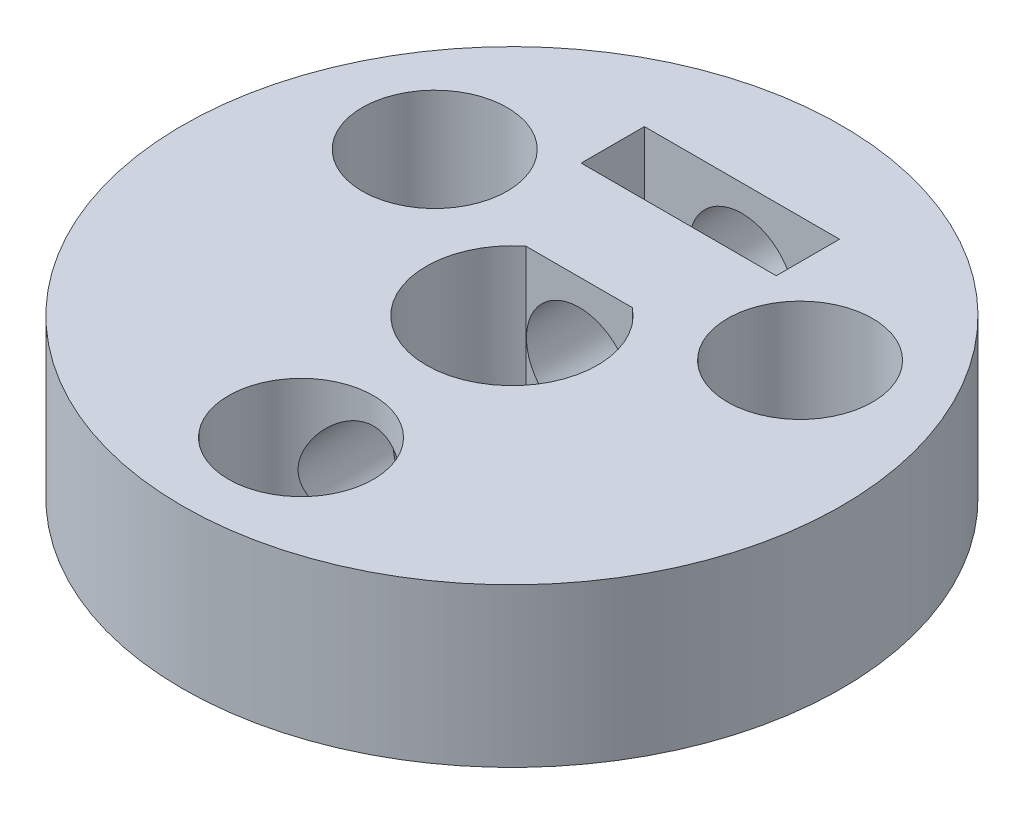
ISO-10303-21;
HEADER;
FILE_DESCRIPTION(('STEP AP214'),'2;1');
FILE_NAME('part.step','',(''),(''),'','','');
FILE_SCHEMA(('AUTOMOTIVE_DESIGN { 1 0 10303 214 1 1 1 1 }'));
ENDSEC;
DATA;
#1=APPLICATION_CONTEXT('core data for automotive mechanical design processes');
#2=APPLICATION_PROTOCOL_DEFINITION('international standard','automotive_design',2000,#1);
#3=PRODUCT_CONTEXT('',#1,'mechanical');
#4=PRODUCT('Part','Part','',(#3));
#5=PRODUCT_RELATED_PRODUCT_CATEGORY('part','',(#4));
#6=PRODUCT_DEFINITION_FORMATION('','',#4);
#7=PRODUCT_DEFINITION_CONTEXT('part definition',#1,'design');
#8=PRODUCT_DEFINITION('design','',#6,#7);
#9=PRODUCT_DEFINITION_SHAPE('','',#8);
#10=(LENGTH_UNIT() NAMED_UNIT(*) SI_UNIT(.MILLI.,.METRE.));
#11=(NAMED_UNIT(*) PLANE_ANGLE_UNIT() SI_UNIT($,.RADIAN.));
#12=(NAMED_UNIT(*) SI_UNIT($,.STERADIAN.) SOLID_ANGLE_UNIT());
#13=UNCERTAINTY_MEASURE_WITH_UNIT(LENGTH_MEASURE(1.E-05),#10,'distance_accuracy_value','');
#14=(GEOMETRIC_REPRESENTATION_CONTEXT(3) GLOBAL_UNCERTAINTY_ASSIGNED_CONTEXT((#13)) GLOBAL_UNIT_ASSIGNED_CONTEXT((#10,
#11,#12)) REPRESENTATION_CONTEXT('',''));
#15=CARTESIAN_POINT('',(0.,0.,0.));
#16=DIRECTION('',(0.,0.,1.));
#17=DIRECTION('',(1.,0.,0.));
#18=AXIS2_PLACEMENT_3D('',#15,#16,#17);
#19=CARTESIAN_POINT('',(0.,3.,-12.501));
#20=DIRECTION('',(0.,0.,1.));
#21=DIRECTION('',(1.,0.,0.));
#22=AXIS2_PLACEMENT_3D('',#19,#20,#21);
#23=CYLINDRICAL_SURFACE('',#22,2.);
#24=CARTESIAN_POINT('',(0.,3.,-6.325));
#25=DIRECTION('',(0.,0.,1.));
#26=DIRECTION('',(1.,0.,0.));
#27=AXIS2_PLACEMENT_3D('',#24,#25,#26);
#28=CIRCLE('',#27,2.);
#29=CARTESIAN_POINT('',(2.,3.,-6.325));
#30=VERTEX_POINT('',#29);
#31=EDGE_CURVE('E101',#30,#30,#28,.T.);
#32=ORIENTED_EDGE('',*,*,#31,.F.);
#33=EDGE_LOOP('',(#32));
#34=FACE_BOUND('',#33,.T.);
#35=CARTESIAN_POINT('',(0.,3.,-2.55));
#36=DIRECTION('',(0.,0.,1.));
#37=DIRECTION('',(1.,0.,0.));
#38=AXIS2_PLACEMENT_3D('',#35,#36,#37);
#39=CIRCLE('',#38,2.);
#40=CARTESIAN_POINT('',(2.,3.,-2.55));
#41=VERTEX_POINT('',#40);
#42=EDGE_CURVE('E188',#41,#41,#39,.T.);
#43=ORIENTED_EDGE('',*,*,#42,.T.);
#44=EDGE_LOOP('',(#43));
#45=FACE_BOUND('',#44,.T.);
#46=ADVANCED_FACE('F33',(#34,#45),#23,.F.);
#47=CARTESIAN_POINT('',(0.,-0.00100000000000013,0.));
#48=DIRECTION('',(0.,1.,0.));
#49=DIRECTION('',(0.,0.,1.));
#50=AXIS2_PLACEMENT_3D('',#47,#48,#49);
#51=CYLINDRICAL_SURFACE('',#50,3.25);
#52=CARTESIAN_POINT('',(0.,0.,0.));
#53=DIRECTION('',(0.,1.,0.));
#54=DIRECTION('',(0.,0.,1.));
#55=AXIS2_PLACEMENT_3D('',#52,#53,#54);
#56=CIRCLE('',#55,3.25);
#57=CARTESIAN_POINT('',(2.01494416796099,0.,-2.55));
#58=VERTEX_POINT('',#57);
#59=CARTESIAN_POINT('',(-2.01494416796099,0.,-2.55));
#60=VERTEX_POINT('',#59);
#61=EDGE_CURVE('E226',#58,#60,#56,.F.);
#62=ORIENTED_EDGE('',*,*,#61,.T.);
#63=DIRECTION('',(0.,1.,0.));
#64=VECTOR('',#63,1.);
#65=CARTESIAN_POINT('',(-2.01494416796099,-0.00100000000000013,-2.55));
#66=LINE('',#65,#64);
#67=CARTESIAN_POINT('',(-2.01494416796099,6.,-2.55));
#68=VERTEX_POINT('',#67);
#69=EDGE_CURVE('E223',#60,#68,#66,.T.);
#70=ORIENTED_EDGE('',*,*,#69,.T.);
#71=CARTESIAN_POINT('',(0.,6.,0.));
#72=DIRECTION('',(0.,1.,0.));
#73=DIRECTION('',(0.,0.,1.));
#74=AXIS2_PLACEMENT_3D('',#71,#72,#73);
#75=CIRCLE('',#74,3.25);
#76=CARTESIAN_POINT('',(2.01494416796099,6.,-2.55));
#77=VERTEX_POINT('',#76);
#78=EDGE_CURVE('E220',#68,#77,#75,.T.);
#79=ORIENTED_EDGE('',*,*,#78,.T.);
#80=DIRECTION('',(0.,1.,0.));
#81=VECTOR('',#80,1.);
#82=CARTESIAN_POINT('',(2.01494416796099,-0.00100000000000013,-2.55));
#83=LINE('',#82,#81);
#84=EDGE_CURVE('E224',#58,#77,#83,.T.);
#85=ORIENTED_EDGE('',*,*,#84,.F.);
#86=EDGE_LOOP('',(#62,#70,#79,#85));
#87=FACE_BOUND('',#86,.T.);
#88=CARTESIAN_POINT('',(-2.,3.,2.5617376914899));
#89=CARTESIAN_POINT('',(-1.99999257295541,2.90021367587737,2.56174918525118));
#90=CARTESIAN_POINT('',(-1.99246417037299,2.80025503727231,2.56767601362471));
#91=CARTESIAN_POINT('',(-1.96287192481038,2.60366049217224,2.59035812934363));
#92=CARTESIAN_POINT('',(-1.94076594329612,2.50703507546794,2.60714480592539));
#93=CARTESIAN_POINT('',(-1.8835566044913,2.32054962789503,2.64876209810368));
#94=CARTESIAN_POINT('',(-1.84856291696548,2.23063999713114,2.6735246252609));
#95=CARTESIAN_POINT('',(-1.76689292791349,2.05808006288375,2.72818612541692));
#96=CARTESIAN_POINT('',(-1.7202169785151,1.97542954069696,2.75808494358867));
#97=CARTESIAN_POINT('',(-1.60945707421707,1.80794695547524,2.82432768187998));
#98=CARTESIAN_POINT('',(-1.54390122328284,1.72421963446998,2.86100475213121));
#99=CARTESIAN_POINT('',(-1.40024942951129,1.56801801513385,2.9339911029288));
#100=CARTESIAN_POINT('',(-1.32214288380353,1.495553334257,2.97030004466079));
#101=CARTESIAN_POINT('',(-1.14466828928344,1.35563852541508,3.04343006835412));
#102=CARTESIAN_POINT('',(-1.04388608423797,1.28973707955523,3.07982491679294));
#103=CARTESIAN_POINT('',(-0.829998273407998,1.17634760006513,3.14420573001945));
#104=CARTESIAN_POINT('',(-0.716904685671716,1.12884181194795,3.17219979688077));
#105=CARTESIAN_POINT('',(-0.493455020388312,1.05865516596643,3.2141269852472));
#106=CARTESIAN_POINT('',(-0.383941651247491,1.03397810292726,3.22918005823652));
#107=CARTESIAN_POINT('',(-0.161406875995682,1.00337189349303,3.24790223797376));
#108=CARTESIAN_POINT('',(-0.0483891205314176,0.997423857860114,3.25158281442983));
#109=CARTESIAN_POINT('',(0.162049292467179,1.00416529414437,3.24743910919448));
#110=CARTESIAN_POINT('',(0.259584307293745,1.01452837228564,3.24105075040065));
#111=CARTESIAN_POINT('',(0.451217466602257,1.04913312115325,3.21996781004166));
#112=CARTESIAN_POINT('',(0.545315350784595,1.07337584069925,3.20527260076766));
#113=CARTESIAN_POINT('',(0.728114732784443,1.13474124467069,3.16876662463579));
#114=CARTESIAN_POINT('',(0.816793912888962,1.17191346204701,3.14692851276278));
#115=CARTESIAN_POINT('',(0.986741059586425,1.25775579590704,3.09785023504571));
#116=CARTESIAN_POINT('',(1.06800724282553,1.30642866905955,3.07060877428869));
#117=CARTESIAN_POINT('',(1.23150771270854,1.42059647790192,3.00905667295497));
#118=CARTESIAN_POINT('',(1.31263932628135,1.48742217468013,2.9742888134627));
#119=CARTESIAN_POINT('',(1.46324196898191,1.63256340191605,2.90316668162461));
#120=CARTESIAN_POINT('',(1.53269615484224,1.71089522877357,2.86681021146441));
#121=CARTESIAN_POINT('',(1.66677126601713,1.88835883785493,2.79123600965826));
#122=CARTESIAN_POINT('',(1.72970500538748,1.98886655865017,2.75222807495995));
#123=CARTESIAN_POINT('',(1.83750522715276,2.20143419355725,2.68146414101565));
#124=CARTESIAN_POINT('',(1.88240513318502,2.31347224861993,2.64969477366942));
#125=CARTESIAN_POINT('',(1.94277592323182,2.51649945346157,2.6055984782368));
#126=CARTESIAN_POINT('',(1.96284611176855,2.60548871095613,2.59037237505277));
#127=CARTESIAN_POINT('',(1.9906591395378,2.78640251047185,2.56906520998618));
#128=CARTESIAN_POINT('',(1.9984178271369,2.87832312317789,2.56297239155587));
#129=CARTESIAN_POINT('',(2.00114663030702,3.06264989769542,2.56084299907488));
#130=CARTESIAN_POINT('',(1.99609222808287,3.15505665223182,2.56482570446798));
#131=CARTESIAN_POINT('',(1.97347366976127,3.33743355474596,2.58226537344572));
#132=CARTESIAN_POINT('',(1.95589930103145,3.42740165125937,2.59573007146108));
#133=CARTESIAN_POINT('',(1.909432939958,3.6017763216543,2.63009111034933));
#134=CARTESIAN_POINT('',(1.88065890022416,3.6862304808719,2.65090979587571));
#135=CARTESIAN_POINT('',(1.8128508130306,3.84934302948884,2.69773358443967));
#136=CARTESIAN_POINT('',(1.77381304826382,3.92799930577396,2.72374056574483));
#137=CARTESIAN_POINT('',(1.67819135872918,4.09287452945857,2.78386834620982));
#138=CARTESIAN_POINT('',(1.61969199947816,4.17776149652796,2.81859731003127));
#139=CARTESIAN_POINT('',(1.49058246781728,4.33743089406434,2.88895845167456));
#140=CARTESIAN_POINT('',(1.41996004836075,4.41220296825735,2.92459151151031));
#141=CARTESIAN_POINT('',(1.25617389414914,4.56076481480659,2.99895961912961));
#142=CARTESIAN_POINT('',(1.16122058586532,4.63276608513036,3.03737154236198));
#143=CARTESIAN_POINT('',(0.958183477689743,4.75959687386271,3.10739260661167));
#144=CARTESIAN_POINT('',(0.850106993802706,4.81443589955526,3.13900551100107));
#145=CARTESIAN_POINT('',(0.630936382808474,4.9012841238324,3.19002043080146));
#146=CARTESIAN_POINT('',(0.520501564418012,4.93455155887919,3.21008568101958));
#147=CARTESIAN_POINT('',(0.294156632496273,4.98161137604269,3.23866087689774));
#148=CARTESIAN_POINT('',(0.178253743828156,4.99542875141624,3.24718565148693));
#149=CARTESIAN_POINT('',(-0.0378027268410501,5.00213793056566,3.25131690471873));
#150=CARTESIAN_POINT('',(-0.137851985970449,4.99772616939037,3.24858812135995));
#151=CARTESIAN_POINT('',(-0.335525204569388,4.97416431700683,3.23415158005857));
#152=CARTESIAN_POINT('',(-0.433149214177646,4.95501453074929,3.22244400789989));
#153=CARTESIAN_POINT('',(-0.620682858784026,4.90366975378791,3.19155972324271));
#154=CARTESIAN_POINT('',(-0.710729957034344,4.87184293264837,3.17259435676908));
#155=CARTESIAN_POINT('',(-0.884164568134433,4.79644160602501,3.12870007035302));
#156=CARTESIAN_POINT('',(-0.967550840855142,4.75286491949961,3.10377004333118));
#157=CARTESIAN_POINT('',(-1.13486211630832,4.6500688570234,3.04683470210327));
#158=CARTESIAN_POINT('',(-1.21790677280195,4.58968078811046,3.01435946659724));
#159=CARTESIAN_POINT('',(-1.37330684343255,4.45754943416423,2.94681592323596));
#160=CARTESIAN_POINT('',(-1.44564976868544,4.38579308140633,2.91174465629415));
#161=CARTESIAN_POINT('',(-1.58788935091968,4.22147353838125,2.83697215514017));
#162=CARTESIAN_POINT('',(-1.65607257145252,4.12740561561978,2.79729946659041));
#163=CARTESIAN_POINT('',(-1.77580045841955,3.9274052149667,2.72286787631167));
#164=CARTESIAN_POINT('',(-1.82735638010146,3.82148082858051,2.68810565961235));
#165=CARTESIAN_POINT('',(-1.90228203697712,3.62437146406799,2.63541980815058));
#166=CARTESIAN_POINT('',(-1.92936930042345,3.53514129911901,2.61547094460358));
#167=CARTESIAN_POINT('',(-1.97090926851511,3.3524551354933,2.58432010382459));
#168=CARTESIAN_POINT('',(-1.98540313448477,3.25901396192308,2.57308964354727));
#169=CARTESIAN_POINT('',(-1.99546246145931,3.13744075169137,2.56527433546932));
#170=CARTESIAN_POINT('',(-1.9971617074068,3.11000299374909,2.56395160976314));
#171=CARTESIAN_POINT('',(-1.99943161838139,3.05504787282921,2.56218161135533));
#172=CARTESIAN_POINT('',(-2.00000204908049,3.02753049451045,2.56173452042478));
#173=CARTESIAN_POINT('',(-2.,3.,2.5617376914899));
#174=B_SPLINE_CURVE_WITH_KNOTS('',3,(#88,#89,#90,#91,#92,#93,#94,#95,#96,#97,#98,#99,#100,#101,
#102,#103,#104,#105,#106,#107,#108,#109,#110,#111,#112,#113,#114,#115,#116,#117,#118,#119,#120,
#121,#122,#123,#124,#125,#126,#127,#128,#129,#130,#131,#132,#133,#134,#135,#136,#137,#138,#139,
#140,#141,#142,#143,#144,#145,#146,#147,#148,#149,#150,#151,#152,#153,#154,#155,#156,#157,#158,
#159,#160,#161,#162,#163,#164,#165,#166,#167,#168,#169,#170,#171,#172,#173),.UNSPECIFIED.,.T.,
.F.,(4,2,2,2,2,2,2,2,2,2,2,2,2,2,2,2,2,2,2,2,2,2,2,2,2,2,2,2,2,2,2,2,2,2,2,2,2,2,2,2,2,2,4),(0.,
0.299232393910509,0.599333574999374,0.896937883517602,1.19453322269994,1.53068544499641,
1.86712315749446,2.24246277721421,2.61743923126028,2.95519221848558,3.29260445425413,
3.58607334277618,3.87956441029894,4.17419245756178,4.46889119795355,4.79971798388065,
5.13101792793272,5.50369761894355,5.87568336785438,6.15197255272927,6.42790578629545,
6.70436741536107,6.98105481488619,7.25490378598819,7.52885207642913,7.85397436334755,
8.1794270516913,8.55312150036134,8.92660856741893,9.27567623393334,9.62429493900469,
9.9233355986358,10.2223700708567,10.5132883786366,10.8042607246735,11.1260850248725,
11.4482819793199,11.8149155513861,12.1813004206788,12.4662731905945,12.7503109893249,
12.8328504181994,12.915406979435),.UNSPECIFIED.);
#175=CARTESIAN_POINT('',(-2.,3.,2.5617376914899));
#176=VERTEX_POINT('',#175);
#177=EDGE_CURVE('E135',#176,#176,#174,.T.);
#178=ORIENTED_EDGE('',*,*,#177,.T.);
#179=EDGE_LOOP('',(#178));
#180=FACE_BOUND('',#179,.T.);
#181=ADVANCED_FACE('F163',(#87,#180),#51,.F.);
#182=CARTESIAN_POINT('',(0.,-0.00100000000000013,8.));
#183=DIRECTION('',(0.,1.,0.));
#184=DIRECTION('',(0.,0.,1.));
#185=AXIS2_PLACEMENT_3D('',#182,#183,#184);
#186=CYLINDRICAL_SURFACE('',#185,2.75);
#187=CARTESIAN_POINT('',(0.,6.,8.));
#188=DIRECTION('',(0.,1.,0.));
#189=DIRECTION('',(0.,0.,1.));
#190=AXIS2_PLACEMENT_3D('',#187,#188,#189);
#191=CIRCLE('',#190,2.75);
#192=CARTESIAN_POINT('',(0.,6.,10.75));
#193=VERTEX_POINT('',#192);
#194=EDGE_CURVE('E195',#193,#193,#191,.T.);
#195=ORIENTED_EDGE('',*,*,#194,.T.);
#196=EDGE_LOOP('',(#195));
#197=FACE_BOUND('',#196,.T.);
#198=CARTESIAN_POINT('',(0.,0.,8.));
#199=DIRECTION('',(0.,1.,0.));
#200=DIRECTION('',(0.,0.,1.));
#201=AXIS2_PLACEMENT_3D('',#198,#199,#200);
#202=CIRCLE('',#201,2.75);
#203=CARTESIAN_POINT('',(0.,0.,10.75));
#204=VERTEX_POINT('',#203);
#205=EDGE_CURVE('E199',#204,#204,#202,.F.);
#206=ORIENTED_EDGE('',*,*,#205,.T.);
#207=EDGE_LOOP('',(#206));
#208=FACE_BOUND('',#207,.T.);
#209=CARTESIAN_POINT('',(-2.,3.,6.11254139118231));
#210=CARTESIAN_POINT('',(-1.99999984155439,3.04728125371528,6.11254108272452));
#211=CARTESIAN_POINT('',(-1.99831819251388,3.09456415963721,6.1107539315617));
#212=CARTESIAN_POINT('',(-1.99164320772081,3.18864606377105,6.10371994513093));
#213=CARTESIAN_POINT('',(-1.98664804287353,3.23544478020654,6.0984711990363));
#214=CARTESIAN_POINT('',(-1.96682839563104,3.37464047942902,6.07790072868115));
#215=CARTESIAN_POINT('',(-1.94717030742436,3.46568782837265,6.05775613818325));
#216=CARTESIAN_POINT('',(-1.89681520265042,3.64055606468464,6.00857174396726));
#217=CARTESIAN_POINT('',(-1.86626096962394,3.72445379518771,5.97964768450189));
#218=CARTESIAN_POINT('',(-1.79534831067652,3.8857069046237,5.91637650200721));
#219=CARTESIAN_POINT('',(-1.75499063610095,3.96306278431826,5.88202979464552));
#220=CARTESIAN_POINT('',(-1.65658671757259,4.12533890890335,5.80389329766668));
#221=CARTESIAN_POINT('',(-1.59662989854071,4.20883802505276,5.75956030901626));
#222=CARTESIAN_POINT('',(-1.46455313632915,4.36587718923576,5.67106790980191));
#223=CARTESIAN_POINT('',(-1.39241669401629,4.43940348061769,5.62690881897529));
#224=CARTESIAN_POINT('',(-1.22191593323149,4.58807671033047,5.5341308332997));
#225=CARTESIAN_POINT('',(-1.12116905018419,4.66097366825202,5.4862137273213));
#226=CARTESIAN_POINT('',(-0.904709730836273,4.78805743517574,5.40048836395184));
#227=CARTESIAN_POINT('',(-0.789030682902019,4.84228502567908,5.36265811408635));
#228=CARTESIAN_POINT('',(-0.580898486641062,4.91599184875347,5.31056425163251));
#229=CARTESIAN_POINT('',(-0.491291877256693,4.94097583705473,5.29265374605196));
#230=CARTESIAN_POINT('',(-0.308196816428559,4.97831209133791,5.2657639589227));
#231=CARTESIAN_POINT('',(-0.214711693803512,4.99067496546422,5.25677717708891));
#232=CARTESIAN_POINT('',(-0.0262808864996537,5.00205876292217,5.24850512077219));
#233=CARTESIAN_POINT('',(0.0686676476823136,5.00104913242008,5.24924206328378));
#234=CARTESIAN_POINT('',(0.25690411803724,4.98567922896213,5.26040248118521));
#235=CARTESIAN_POINT('',(0.350191620696873,4.9713155212999,5.27082844861934));
#236=CARTESIAN_POINT('',(0.529811030388283,4.93068422906926,5.3000278103106));
#237=CARTESIAN_POINT('',(0.616266091321901,4.90477308633253,5.31855095870417));
#238=CARTESIAN_POINT('',(0.783356660834583,4.84236664354322,5.36251529894373));
#239=CARTESIAN_POINT('',(0.863990979736847,4.80586918740512,5.38795789998984));
#240=CARTESIAN_POINT('',(1.02685156913081,4.71901503938701,5.44727715956325));
#241=CARTESIAN_POINT('',(1.10826822517769,4.66757220257491,5.48177528707053));
#242=CARTESIAN_POINT('',(1.26174159175043,4.55470238132046,5.55505501065001));
#243=CARTESIAN_POINT('',(1.33378912710009,4.49326574048607,5.59384073783225));
#244=CARTESIAN_POINT('',(1.48075296770533,4.34903503832561,5.68084794868906));
#245=CARTESIAN_POINT('',(1.55363052271214,4.26439956968405,5.72946574964715));
#246=CARTESIAN_POINT('',(1.68476999709799,4.08352761704406,5.82500142856327));
#247=CARTESIAN_POINT('',(1.74302982684384,3.98728947732842,5.87191906265979));
#248=CARTESIAN_POINT('',(1.83263084837037,3.80582562868107,5.94898385897202));
#249=CARTESIAN_POINT('',(1.86707016477259,3.72274533167856,5.98056051726082));
#250=CARTESIAN_POINT('',(1.92492794619532,3.55034165900098,6.03562845535775));
#251=CARTESIAN_POINT('',(1.94837113565918,3.4610328128955,6.05913784188509));
#252=CARTESIAN_POINT('',(1.97999685641612,3.29273070436806,6.09145469921778));
#253=CARTESIAN_POINT('',(1.99004865362631,3.21444035512654,6.10203824792857));
#254=CARTESIAN_POINT('',(2.00076253499095,3.0565321144089,6.11333151346848));
#255=CARTESIAN_POINT('',(2.00143259480512,2.97691540816812,6.11404961716003));
#256=CARTESIAN_POINT('',(1.99334933188403,2.81883632979744,6.10551160206503));
#257=CARTESIAN_POINT('',(1.98460796100032,2.74037262156915,6.09626813375628));
#258=CARTESIAN_POINT('',(1.9583326610144,2.58641172995985,6.0692541673511));
#259=CARTESIAN_POINT('',(1.94078511877718,2.51091933527805,6.05147046906782));
#260=CARTESIAN_POINT('',(1.88906507232879,2.33443475357644,6.00107653637737));
#261=CARTESIAN_POINT('',(1.85103979225192,2.23546702410755,5.96537890389258));
#262=CARTESIAN_POINT('',(1.76135257634627,2.0467956452537,5.88725791180085));
#263=CARTESIAN_POINT('',(1.70966337626722,1.95711102238374,5.8448211737024));
#264=CARTESIAN_POINT('',(1.59206043862426,1.78487465727457,5.75647163938782));
#265=CARTESIAN_POINT('',(1.52576759508555,1.70261637044464,5.71049284765223));
#266=CARTESIAN_POINT('',(1.38062092197828,1.54912858237901,5.62014897517391));
#267=CARTESIAN_POINT('',(1.30177760385993,1.47788994939587,5.57578258185342));
#268=CARTESIAN_POINT('',(1.13578712781601,1.35062757010063,5.49387305891844));
#269=CARTESIAN_POINT('',(1.04915614905013,1.29407336279905,5.45611595044951));
#270=CARTESIAN_POINT('',(0.865858942533445,1.19412977402688,5.38804103320956));
#271=CARTESIAN_POINT('',(0.769195528442628,1.15073671474821,5.35772114660292));
#272=CARTESIAN_POINT('',(0.566909814049588,1.07900824809115,5.30703537478398));
#273=CARTESIAN_POINT('',(0.461219613556808,1.05080123908047,5.28675448185376));
#274=CARTESIAN_POINT('',(0.245057376585389,1.0120458685135,5.25878194086196));
#275=CARTESIAN_POINT('',(0.134590786945295,1.00147790981747,5.25107632177293));
#276=CARTESIAN_POINT('',(-0.0707535425724048,0.99900112384757,5.24927227483213));
#277=CARTESIAN_POINT('',(-0.165597341304916,1.00463603468782,5.25338259333128));
#278=CARTESIAN_POINT('',(-0.352650739038191,1.02907868469812,5.27108830644071));
#279=CARTESIAN_POINT('',(-0.444860224453036,1.04788699098708,5.28468410940405));
#280=CARTESIAN_POINT('',(-0.622285231512081,1.09708979758927,5.31983595508423));
#281=CARTESIAN_POINT('',(-0.707607862604178,1.12722908974504,5.34121635287552));
#282=CARTESIAN_POINT('',(-0.871833031446705,1.1978060852343,5.39044743299996));
#283=CARTESIAN_POINT('',(-0.950734528941587,1.23824545286612,5.41829916091436));
#284=CARTESIAN_POINT('',(-1.11114763837623,1.33410552876013,5.48280323020027));
#285=CARTESIAN_POINT('',(-1.19162125544056,1.39080097918136,5.52013257372991));
#286=CARTESIAN_POINT('',(-1.34248104361179,1.51431201512418,5.59844083392049));
#287=CARTESIAN_POINT('',(-1.4128533683846,1.58114123843664,5.63942463757659));
#288=CARTESIAN_POINT('',(-1.55536987895687,1.73744257655355,5.73025573861683));
#289=CARTESIAN_POINT('',(-1.6253167412596,1.82880501427508,5.78030932011037));
#290=CARTESIAN_POINT('',(-1.74928544003336,2.02362423249869,5.87664334651066));
#291=CARTESIAN_POINT('',(-1.80331745567091,2.1270732230151,5.92292618942364));
#292=CARTESIAN_POINT('',(-1.88040197557088,2.31363373424774,5.99289543180285));
#293=CARTESIAN_POINT('',(-1.90789408021137,2.39390741277408,6.01923856680382));
#294=CARTESIAN_POINT('',(-1.95272574535588,2.55937634956255,6.06341354783789));
#295=CARTESIAN_POINT('',(-1.97009851594416,2.64455448910842,6.0812731993297));
#296=CARTESIAN_POINT('',(-1.98786108592832,2.7754725163496,6.09974298563071));
#297=CARTESIAN_POINT('',(-1.99240135513712,2.8201066947241,6.10451739698233));
#298=CARTESIAN_POINT('',(-1.99847123323078,2.90982668040289,6.11091710823144));
#299=CARTESIAN_POINT('',(-2.00000015109375,2.95491258898169,6.11254168532771));
#300=CARTESIAN_POINT('',(-2.,3.,6.11254139118231));
#301=B_SPLINE_CURVE_WITH_KNOTS('',3,(#209,#210,#211,#212,#213,#214,#215,#216,#217,#218,#219,
#220,#221,#222,#223,#224,#225,#226,#227,#228,#229,#230,#231,#232,#233,#234,#235,#236,#237,#238,
#239,#240,#241,#242,#243,#244,#245,#246,#247,#248,#249,#250,#251,#252,#253,#254,#255,#256,#257,
#258,#259,#260,#261,#262,#263,#264,#265,#266,#267,#268,#269,#270,#271,#272,#273,#274,#275,#276,
#277,#278,#279,#280,#281,#282,#283,#284,#285,#286,#287,#288,#289,#290,#291,#292,#293,#294,#295,
#296,#297,#298,#299,#300),.UNSPECIFIED.,.T.,.F.,(4,2,2,2,2,2,2,2,2,2,2,2,2,2,2,2,2,2,2,2,2,2,2,
2,2,2,2,2,2,2,2,2,2,2,2,2,2,2,2,2,2,2,2,2,2,4),(0.,0.141780251610715,0.283638832576155,
0.567795569880796,0.848357838734387,1.1288986118011,1.46357899813969,1.79871645140672,
2.19628974186973,2.59298897655345,2.87598264907521,3.15873826689996,3.44214004307774,
3.72561473116405,4.00088758297481,4.27621653826873,4.58198562409936,4.88805192994563,
5.25205685967923,5.61611379503982,5.90113071429679,6.18550367313058,6.4233502833485,
6.66099468166886,6.89833764398655,7.13604864144728,7.4698270622182,7.80427658055234,
8.14872622857579,8.49288889162624,8.82194975455535,9.15091857839341,9.48262681885583,
9.81396628264477,10.0978370913567,10.3817201215498,10.6595589850939,10.9374427706805,
11.2521252039553,11.5672349508123,11.9421339181895,12.3167925761617,12.5824642726697,
12.8472590906456,12.9824297466813,13.1176314170335),.UNSPECIFIED.);
#302=CARTESIAN_POINT('',(-2.,3.,6.11254139118231));
#303=VERTEX_POINT('',#302);
#304=EDGE_CURVE('E127',#303,#303,#301,.T.);
#305=ORIENTED_EDGE('',*,*,#304,.T.);
#306=EDGE_LOOP('',(#305));
#307=FACE_BOUND('',#306,.T.);
#308=ADVANCED_FACE('F169',(#197,#208,#307),#186,.F.);
#309=CARTESIAN_POINT('',(0.,6.,0.));
#310=DIRECTION('',(0.,1.,0.));
#311=DIRECTION('',(0.,0.,1.));
#312=AXIS2_PLACEMENT_3D('',#309,#310,#311);
#313=PLANE('',#312);
#314=DIRECTION('',(1.,0.,0.));
#315=VECTOR('',#314,1.);
#316=CARTESIAN_POINT('',(-3.7,6.,-6.325));
#317=LINE('',#316,#315);
#318=CARTESIAN_POINT('',(-3.7,6.,-6.325));
#319=VERTEX_POINT('',#318);
#320=CARTESIAN_POINT('',(3.7,6.,-6.325));
#321=VERTEX_POINT('',#320);
#322=EDGE_CURVE('E94',#319,#321,#317,.T.);
#323=ORIENTED_EDGE('',*,*,#322,.F.);
#324=DIRECTION('',(0.,0.,1.));
#325=VECTOR('',#324,1.);
#326=CARTESIAN_POINT('',(-3.7,6.,-6.325));
#327=LINE('',#326,#325);
#328=CARTESIAN_POINT('',(-3.7,6.,-8.725));
#329=VERTEX_POINT('',#328);
#330=EDGE_CURVE('E115',#329,#319,#327,.T.);
#331=ORIENTED_EDGE('',*,*,#330,.F.);
#332=DIRECTION('',(-1.,0.,0.));
#333=VECTOR('',#332,1.);
#334=CARTESIAN_POINT('',(-3.7,6.,-8.725));
#335=LINE('',#334,#333);
#336=CARTESIAN_POINT('',(3.7,6.,-8.725));
#337=VERTEX_POINT('',#336);
#338=EDGE_CURVE('E109',#337,#329,#335,.T.);
#339=ORIENTED_EDGE('',*,*,#338,.F.);
#340=DIRECTION('',(0.,0.,-1.));
#341=VECTOR('',#340,1.);
#342=CARTESIAN_POINT('',(3.7,6.,-6.325));
#343=LINE('',#342,#341);
#344=EDGE_CURVE('E48',#321,#337,#343,.T.);
#345=ORIENTED_EDGE('',*,*,#344,.F.);
#346=EDGE_LOOP('',(#323,#331,#339,#345));
#347=FACE_BOUND('',#346,.T.);
#348=ORIENTED_EDGE('',*,*,#194,.F.);
#349=EDGE_LOOP('',(#348));
#350=FACE_BOUND('',#349,.T.);
#351=CARTESIAN_POINT('',(-6.9282032302755,6.,-4.00000000000003));
#352=DIRECTION('',(0.,1.,0.));
#353=DIRECTION('',(0.,0.,1.));
#354=AXIS2_PLACEMENT_3D('',#351,#352,#353);
#355=CIRCLE('',#354,2.75);
#356=CARTESIAN_POINT('',(-6.9282032302755,6.,-1.25000000000003));
#357=VERTEX_POINT('',#356);
#358=EDGE_CURVE('E204',#357,#357,#355,.T.);
#359=ORIENTED_EDGE('',*,*,#358,.F.);
#360=EDGE_LOOP('',(#359));
#361=FACE_BOUND('',#360,.T.);
#362=CARTESIAN_POINT('',(6.92820323027555,6.,-3.99999999999994));
#363=DIRECTION('',(0.,1.,0.));
#364=DIRECTION('',(0.,0.,1.));
#365=AXIS2_PLACEMENT_3D('',#362,#363,#364);
#366=CIRCLE('',#365,2.75);
#367=CARTESIAN_POINT('',(6.92820323027555,6.,-1.24999999999994));
#368=VERTEX_POINT('',#367);
#369=EDGE_CURVE('E210',#368,#368,#366,.T.);
#370=ORIENTED_EDGE('',*,*,#369,.F.);
#371=EDGE_LOOP('',(#370));
#372=FACE_BOUND('',#371,.T.);
#373=CARTESIAN_POINT('',(0.,6.,0.));
#374=DIRECTION('',(0.,1.,0.));
#375=DIRECTION('',(0.,0.,1.));
#376=AXIS2_PLACEMENT_3D('',#373,#374,#375);
#377=CIRCLE('',#376,12.5);
#378=CARTESIAN_POINT('',(0.,6.,12.5));
#379=VERTEX_POINT('',#378);
#380=EDGE_CURVE('E11',#379,#379,#377,.T.);
#381=ORIENTED_EDGE('',*,*,#380,.T.);
#382=EDGE_LOOP('',(#381));
#383=FACE_BOUND('',#382,.T.);
#384=ORIENTED_EDGE('',*,*,#78,.F.);
#385=DIRECTION('',(1.,0.,0.));
#386=VECTOR('',#385,1.);
#387=CARTESIAN_POINT('',(0.,6.,-2.55));
#388=LINE('',#387,#386);
#389=EDGE_CURVE('E217',#68,#77,#388,.T.);
#390=ORIENTED_EDGE('',*,*,#389,.T.);
#391=EDGE_LOOP('',(#384,#390));
#392=FACE_BOUND('',#391,.T.);
#393=ADVANCED_FACE('F238',(#347,#350,#361,#372,#383,#392),#313,.T.);
#394=CARTESIAN_POINT('',(0.,0.,0.));
#395=DIRECTION('',(0.,1.,0.));
#396=DIRECTION('',(0.,0.,1.));
#397=AXIS2_PLACEMENT_3D('',#394,#395,#396);
#398=PLANE('',#397);
#399=DIRECTION('',(0.,0.,-1.));
#400=VECTOR('',#399,1.);
#401=CARTESIAN_POINT('',(-3.7,0.,-6.325));
#402=LINE('',#401,#400);
#403=CARTESIAN_POINT('',(-3.7,0.,-6.325));
#404=VERTEX_POINT('',#403);
#405=CARTESIAN_POINT('',(-3.7,0.,-8.725));
#406=VERTEX_POINT('',#405);
#407=EDGE_CURVE('E56',#404,#406,#402,.T.);
#408=ORIENTED_EDGE('',*,*,#407,.F.);
#409=DIRECTION('',(-1.,0.,0.));
#410=VECTOR('',#409,1.);
#411=CARTESIAN_POINT('',(-3.7,0.,-6.325));
#412=LINE('',#411,#410);
#413=CARTESIAN_POINT('',(3.7,0.,-6.325));
#414=VERTEX_POINT('',#413);
#415=EDGE_CURVE('E107',#414,#404,#412,.T.);
#416=ORIENTED_EDGE('',*,*,#415,.F.);
#417=DIRECTION('',(0.,0.,1.));
#418=VECTOR('',#417,1.);
#419=CARTESIAN_POINT('',(3.7,0.,-6.325));
#420=LINE('',#419,#418);
#421=CARTESIAN_POINT('',(3.7,0.,-8.725));
#422=VERTEX_POINT('',#421);
#423=EDGE_CURVE('E88',#422,#414,#420,.T.);
#424=ORIENTED_EDGE('',*,*,#423,.F.);
#425=DIRECTION('',(1.,0.,0.));
#426=VECTOR('',#425,1.);
#427=CARTESIAN_POINT('',(-3.7,0.,-8.725));
#428=LINE('',#427,#426);
#429=EDGE_CURVE('E97',#406,#422,#428,.T.);
#430=ORIENTED_EDGE('',*,*,#429,.F.);
#431=EDGE_LOOP('',(#408,#416,#424,#430));
#432=FACE_BOUND('',#431,.T.);
#433=ORIENTED_EDGE('',*,*,#205,.F.);
#434=EDGE_LOOP('',(#433));
#435=FACE_BOUND('',#434,.T.);
#436=CARTESIAN_POINT('',(-6.9282032302755,0.,-4.00000000000003));
#437=DIRECTION('',(0.,1.,0.));
#438=DIRECTION('',(0.,0.,1.));
#439=AXIS2_PLACEMENT_3D('',#436,#437,#438);
#440=CIRCLE('',#439,2.75);
#441=CARTESIAN_POINT('',(-6.9282032302755,0.,-1.25000000000003));
#442=VERTEX_POINT('',#441);
#443=EDGE_CURVE('E200',#442,#442,#440,.F.);
#444=ORIENTED_EDGE('',*,*,#443,.F.);
#445=EDGE_LOOP('',(#444));
#446=FACE_BOUND('',#445,.T.);
#447=CARTESIAN_POINT('',(6.92820323027555,0.,-3.99999999999994));
#448=DIRECTION('',(0.,1.,0.));
#449=DIRECTION('',(0.,0.,1.));
#450=AXIS2_PLACEMENT_3D('',#447,#448,#449);
#451=CIRCLE('',#450,2.75);
#452=CARTESIAN_POINT('',(6.92820323027555,0.,-1.24999999999994));
#453=VERTEX_POINT('',#452);
#454=EDGE_CURVE('E207',#453,#453,#451,.F.);
#455=ORIENTED_EDGE('',*,*,#454,.F.);
#456=EDGE_LOOP('',(#455));
#457=FACE_BOUND('',#456,.T.);
#458=CARTESIAN_POINT('',(0.,0.,0.));
#459=DIRECTION('',(0.,1.,0.));
#460=DIRECTION('',(0.,0.,1.));
#461=AXIS2_PLACEMENT_3D('',#458,#459,#460);
#462=CIRCLE('',#461,12.5);
#463=CARTESIAN_POINT('',(0.,0.,12.5));
#464=VERTEX_POINT('',#463);
#465=EDGE_CURVE('E37',#464,#464,#462,.T.);
#466=ORIENTED_EDGE('',*,*,#465,.F.);
#467=EDGE_LOOP('',(#466));
#468=FACE_BOUND('',#467,.T.);
#469=DIRECTION('',(-1.,0.,0.));
#470=VECTOR('',#469,1.);
#471=CARTESIAN_POINT('',(0.,0.,-2.55));
#472=LINE('',#471,#470);
#473=EDGE_CURVE('E203',#58,#60,#472,.T.);
#474=ORIENTED_EDGE('',*,*,#473,.T.);
#475=ORIENTED_EDGE('',*,*,#61,.F.);
#476=EDGE_LOOP('',(#474,#475));
#477=FACE_BOUND('',#476,.T.);
#478=ADVANCED_FACE('F104',(#432,#435,#446,#457,#468,#477),#398,.F.);
#479=CARTESIAN_POINT('',(0.,6.,0.));
#480=DIRECTION('',(0.,-1.,0.));
#481=DIRECTION('',(0.,0.,-1.));
#482=AXIS2_PLACEMENT_3D('',#479,#480,#481);
#483=CYLINDRICAL_SURFACE('',#482,12.5);
#484=CARTESIAN_POINT('',(2.,3.,-12.3389626792531));
#485=CARTESIAN_POINT('',(1.99999546268269,2.8884332846304,-12.3389646365747));
#486=CARTESIAN_POINT('',(1.99063305520351,2.77680405912362,-12.3404922170901));
#487=CARTESIAN_POINT('',(1.95344445500885,2.55667315265537,-12.3464325117521));
#488=CARTESIAN_POINT('',(1.92560083019994,2.44817452549539,-12.3508479497636));
#489=CARTESIAN_POINT('',(1.85230972937127,2.23752268689873,-12.3620513503607));
#490=CARTESIAN_POINT('',(1.8068764692589,2.13536442835474,-12.3688373965941));
#491=CARTESIAN_POINT('',(1.69973041648431,1.94013351961156,-12.3840151290006));
#492=CARTESIAN_POINT('',(1.63801962395043,1.84705975506411,-12.3924066178675));
#493=CARTESIAN_POINT('',(1.4994714023648,1.67178106720471,-12.409935008592));
#494=CARTESIAN_POINT('',(1.42251498707585,1.58967073449018,-12.4190774196954));
#495=CARTESIAN_POINT('',(1.25591709815232,1.43947054033987,-12.4370285016078));
#496=CARTESIAN_POINT('',(1.16627489597169,1.37138148469925,-12.4458371532121));
#497=CARTESIAN_POINT('',(0.976239917029318,1.2508040387083,-12.4621862608068));
#498=CARTESIAN_POINT('',(0.875790844473845,1.19840330966189,-12.4697194921289));
#499=CARTESIAN_POINT('',(0.667375995890959,1.11125306094002,-12.4826077762261));
#500=CARTESIAN_POINT('',(0.559410671172465,1.07650248250932,-12.4879629596488));
#501=CARTESIAN_POINT('',(0.340004128946068,1.02592725563757,-12.4958528816707));
#502=CARTESIAN_POINT('',(0.228600363359407,1.00994388059489,-12.49841126176));
#503=CARTESIAN_POINT('',(0.0046648075222521,0.996863491914293,-12.500500461766));
#504=CARTESIAN_POINT('',(-0.10786691136301,0.999765290855068,-12.5000314720312));
#505=CARTESIAN_POINT('',(-0.329779715978531,1.02424848568502,-12.4961375614702));
#506=CARTESIAN_POINT('',(-0.439180187321414,1.04565908424732,-12.4927396690852));
#507=CARTESIAN_POINT('',(-0.652815342747673,1.10628351462465,-12.4833998597574));
#508=CARTESIAN_POINT('',(-0.757049879228181,1.14549785480941,-12.4774578701704));
#509=CARTESIAN_POINT('',(-0.957905986409038,1.24078845870011,-12.4636513003451));
#510=CARTESIAN_POINT('',(-1.05449329349384,1.29693572739581,-12.4557786507463));
#511=CARTESIAN_POINT('',(-1.23693967157033,1.42444642861699,-12.4389865614945));
#512=CARTESIAN_POINT('',(-1.32279794013346,1.49581099817078,-12.4300670436423));
#513=CARTESIAN_POINT('',(-1.48235721573536,1.65267956356024,-12.4120565702159));
#514=CARTESIAN_POINT('',(-1.555911508216,1.7383327758409,-12.4029648129688));
#515=CARTESIAN_POINT('',(-1.68762680827441,1.92084275627193,-12.3857313850728));
#516=CARTESIAN_POINT('',(-1.74578769456446,2.0176996126894,-12.3775897219101));
#517=CARTESIAN_POINT('',(-1.84509031627292,2.22003050995701,-12.3631781549851));
#518=CARTESIAN_POINT('',(-1.88621545421918,2.32551283515635,-12.3569100782548));
#519=CARTESIAN_POINT('',(-1.95012354011945,2.54201062164332,-12.3469864391895));
#520=CARTESIAN_POINT('',(-1.97290796919511,2.65302563536433,-12.343330665898));
#521=CARTESIAN_POINT('',(-1.99928349997629,2.87612782267347,-12.3390860491727));
#522=CARTESIAN_POINT('',(-2.0030832637492,2.98818971468437,-12.338463865144));
#523=CARTESIAN_POINT('',(-1.99193667548245,3.21134896626565,-12.3402681873056));
#524=CARTESIAN_POINT('',(-1.97699098847046,3.32244635991249,-12.3426945853421));
#525=CARTESIAN_POINT('',(-1.92895527704861,3.53986690544439,-12.3502919469979));
#526=CARTESIAN_POINT('',(-1.89597053344241,3.64621392318077,-12.3554469800096));
#527=CARTESIAN_POINT('',(-1.81290306911356,3.85187038701668,-12.3679074973821));
#528=CARTESIAN_POINT('',(-1.76281939829005,3.95117944168186,-12.3752131012361));
#529=CARTESIAN_POINT('',(-1.64647965217412,4.14087239308146,-12.3912295180301));
#530=CARTESIAN_POINT('',(-1.58008930093855,4.23117295357006,-12.3999517832886));
#531=CARTESIAN_POINT('',(-1.43320604247695,4.39942606063674,-12.4177848415153));
#532=CARTESIAN_POINT('',(-1.35271222391417,4.47737780864004,-12.426895659562));
#533=CARTESIAN_POINT('',(-1.17898475488122,4.61947729209286,-12.4445842082074));
#534=CARTESIAN_POINT('',(-1.08563688229299,4.68348622911078,-12.4531560233311));
#535=CARTESIAN_POINT('',(-0.889391847388558,4.7949130459885,-12.4687070996718));
#536=CARTESIAN_POINT('',(-0.786494974976326,4.8423314293228,-12.4756864092145));
#537=CARTESIAN_POINT('',(-0.574493777094341,4.91901272401869,-12.4872402999743));
#538=CARTESIAN_POINT('',(-0.46541676309858,4.94834960623599,-12.491824666927));
#539=CARTESIAN_POINT('',(-0.243805255219827,4.98827383639251,-12.4981133908354));
#540=CARTESIAN_POINT('',(-0.131271023257732,4.99886260115402,-12.4998179654206));
#541=CARTESIAN_POINT('',(0.0927181607457109,5.00095179807928,-12.5001523384762));
#542=CARTESIAN_POINT('',(0.204171144782975,4.99266389940292,-12.4988162330541));
#543=CARTESIAN_POINT('',(0.424076331137222,4.95769116172815,-12.4932886224694));
#544=CARTESIAN_POINT('',(0.532528547140255,4.93100640664942,-12.4890971303321));
#545=CARTESIAN_POINT('',(0.743282123112944,4.86007617517217,-12.4783277894448));
#546=CARTESIAN_POINT('',(0.845589202324673,4.81584732795195,-12.471752200968));
#547=CARTESIAN_POINT('',(1.04136319830549,4.71110753962108,-12.4569342995937));
#548=CARTESIAN_POINT('',(1.13482974947654,4.65059592553781,-12.4486919178104));
#549=CARTESIAN_POINT('',(1.31133889146831,4.51425167961562,-12.4313454639236));
#550=CARTESIAN_POINT('',(1.39426053318836,4.4382634970135,-12.4222331866072));
#551=CARTESIAN_POINT('',(1.54625119082762,4.27345013113633,-12.4042323453373));
#552=CARTESIAN_POINT('',(1.61531695647598,4.18462194427879,-12.3953438343009));
#553=CARTESIAN_POINT('',(1.73804191736152,3.99597082608101,-12.3787350502446));
#554=CARTESIAN_POINT('',(1.79159866107389,3.89608054974353,-12.3710226983478));
#555=CARTESIAN_POINT('',(1.88109182389773,3.68864171033667,-12.35773272045));
#556=CARTESIAN_POINT('',(1.91704612842095,3.58110104845882,-12.3521529288763));
#557=CARTESIAN_POINT('',(1.96235985662764,3.39426204187937,-12.3450187006154));
#558=CARTESIAN_POINT('',(1.97645270113688,3.31610470652852,-12.3427600761638));
#559=CARTESIAN_POINT('',(1.99527431170452,3.15864210543938,-12.339731381368));
#560=CARTESIAN_POINT('',(2.00000322655819,3.07933685796189,-12.3389612873707));
#561=CARTESIAN_POINT('',(2.,3.,-12.3389626792531));
#562=B_SPLINE_CURVE_WITH_KNOTS('',3,(#484,#485,#486,#487,#488,#489,#490,#491,#492,#493,#494,
#495,#496,#497,#498,#499,#500,#501,#502,#503,#504,#505,#506,#507,#508,#509,#510,#511,#512,#513,
#514,#515,#516,#517,#518,#519,#520,#521,#522,#523,#524,#525,#526,#527,#528,#529,#530,#531,#532,
#533,#534,#535,#536,#537,#538,#539,#540,#541,#542,#543,#544,#545,#546,#547,#548,#549,#550,#551,
#552,#553,#554,#555,#556,#557,#558,#559,#560,#561),.UNSPECIFIED.,.T.,.F.,(4,2,2,2,2,2,2,2,2,2,2,
2,2,2,2,2,2,2,2,2,2,2,2,2,2,2,2,2,2,2,2,2,2,2,2,2,2,2,4),(0.,0.334410082462096,0.66913604063283,
1.00359203680449,1.33800695527949,1.6751426933581,2.01229780104021,2.35130309503299,
2.69028805118043,3.02638485112864,3.36246051891023,3.69546762348862,4.0284842373816,
4.3629171817807,4.69737512358616,5.03557384337791,5.37377522782555,5.71230534220323,
6.05080811551122,6.3855820633356,6.72034413480418,7.05317297710996,7.38602031604106,
7.7217061792982,8.05741374188326,8.39632425403564,8.73522448035855,9.07272891067331,
9.41020783420237,9.74392117047707,10.0776329844847,10.4110292424998,10.7444392820194,
11.0813822106389,11.4184040861632,11.7576040091322,12.0964585602663,12.3342666441618,
12.5720709491951),.UNSPECIFIED.);
#563=CARTESIAN_POINT('',(2.,3.,-12.3389626792531));
#564=VERTEX_POINT('',#563);
#565=EDGE_CURVE('E136',#564,#564,#562,.T.);
#566=ORIENTED_EDGE('',*,*,#565,.F.);
#567=EDGE_LOOP('',(#566));
#568=FACE_BOUND('',#567,.T.);
#569=ORIENTED_EDGE('',*,*,#380,.F.);
#570=EDGE_LOOP('',(#569));
#571=FACE_BOUND('',#570,.T.);
#572=ORIENTED_EDGE('',*,*,#465,.T.);
#573=EDGE_LOOP('',(#572));
#574=FACE_BOUND('',#573,.T.);
#575=ADVANCED_FACE('F35',(#568,#571,#574),#483,.T.);
#576=CARTESIAN_POINT('',(0.,-0.00100000000000013,-2.55));
#577=DIRECTION('',(0.,0.,1.));
#578=DIRECTION('',(1.,0.,0.));
#579=AXIS2_PLACEMENT_3D('',#576,#577,#578);
#580=PLANE('',#579);
#581=ORIENTED_EDGE('',*,*,#42,.F.);
#582=EDGE_LOOP('',(#581));
#583=FACE_BOUND('',#582,.T.);
#584=ORIENTED_EDGE('',*,*,#84,.T.);
#585=ORIENTED_EDGE('',*,*,#389,.F.);
#586=ORIENTED_EDGE('',*,*,#69,.F.);
#587=ORIENTED_EDGE('',*,*,#473,.F.);
#588=EDGE_LOOP('',(#584,#585,#586,#587));
#589=FACE_BOUND('',#588,.T.);
#590=ADVANCED_FACE('F240',(#583,#589),#580,.T.);
#591=CARTESIAN_POINT('',(6.92820323027555,-0.00100000000000013,-3.99999999999994));
#592=DIRECTION('',(0.,1.,0.));
#593=DIRECTION('',(0.,0.,1.));
#594=AXIS2_PLACEMENT_3D('',#591,#592,#593);
#595=CYLINDRICAL_SURFACE('',#594,2.75);
#596=CARTESIAN_POINT('',(6.92820323027555,6.,-1.24999999999994));
#597=CARTESIAN_POINT('',(6.92820323027555,5.9375,-1.24999999999994));
#598=CARTESIAN_POINT('',(6.92820323027555,5.875,-1.24999999999994));
#599=CARTESIAN_POINT('',(6.92820323027555,5.75,-1.24999999999994));
#600=CARTESIAN_POINT('',(6.92820323027555,5.6875,-1.24999999999994));
#601=CARTESIAN_POINT('',(6.92820323027555,5.5625,-1.24999999999994));
#602=CARTESIAN_POINT('',(6.92820323027555,5.5,-1.24999999999994));
#603=CARTESIAN_POINT('',(6.92820323027555,5.375,-1.24999999999994));
#604=CARTESIAN_POINT('',(6.92820323027555,5.3125,-1.24999999999994));
#605=CARTESIAN_POINT('',(6.92820323027555,5.1875,-1.24999999999994));
#606=CARTESIAN_POINT('',(6.92820323027555,5.125,-1.24999999999994));
#607=CARTESIAN_POINT('',(6.92820323027555,5.,-1.24999999999994));
#608=CARTESIAN_POINT('',(6.92820323027555,4.9375,-1.24999999999994));
#609=CARTESIAN_POINT('',(6.92820323027555,4.8125,-1.24999999999994));
#610=CARTESIAN_POINT('',(6.92820323027555,4.75,-1.24999999999994));
#611=CARTESIAN_POINT('',(6.92820323027555,4.625,-1.24999999999994));
#612=CARTESIAN_POINT('',(6.92820323027555,4.5625,-1.24999999999994));
#613=CARTESIAN_POINT('',(6.92820323027555,4.4375,-1.24999999999994));
#614=CARTESIAN_POINT('',(6.92820323027555,4.375,-1.24999999999994));
#615=CARTESIAN_POINT('',(6.92820323027555,4.25,-1.24999999999994));
#616=CARTESIAN_POINT('',(6.92820323027555,4.1875,-1.24999999999994));
#617=CARTESIAN_POINT('',(6.92820323027555,4.0625,-1.24999999999994));
#618=CARTESIAN_POINT('',(6.92820323027555,4.,-1.24999999999994));
#619=CARTESIAN_POINT('',(6.92820323027555,3.875,-1.24999999999994));
#620=CARTESIAN_POINT('',(6.92820323027555,3.8125,-1.24999999999994));
#621=CARTESIAN_POINT('',(6.92820323027555,3.6875,-1.24999999999994));
#622=CARTESIAN_POINT('',(6.92820323027555,3.625,-1.24999999999994));
#623=CARTESIAN_POINT('',(6.92820323027555,3.5,-1.24999999999994));
#624=CARTESIAN_POINT('',(6.92820323027555,3.4375,-1.24999999999994));
#625=CARTESIAN_POINT('',(6.92820323027555,3.3125,-1.24999999999994));
#626=CARTESIAN_POINT('',(6.92820323027555,3.25,-1.24999999999994));
#627=CARTESIAN_POINT('',(6.92820323027555,3.125,-1.24999999999994));
#628=CARTESIAN_POINT('',(6.92820323027555,3.0625,-1.24999999999994));
#629=CARTESIAN_POINT('',(6.92820323027555,2.9375,-1.24999999999994));
#630=CARTESIAN_POINT('',(6.92820323027555,2.875,-1.24999999999994));
#631=CARTESIAN_POINT('',(6.92820323027555,2.75,-1.24999999999994));
#632=CARTESIAN_POINT('',(6.92820323027555,2.6875,-1.24999999999994));
#633=CARTESIAN_POINT('',(6.92820323027555,2.5625,-1.24999999999994));
#634=CARTESIAN_POINT('',(6.92820323027555,2.5,-1.24999999999994));
#635=CARTESIAN_POINT('',(6.92820323027555,2.375,-1.24999999999994));
#636=CARTESIAN_POINT('',(6.92820323027555,2.3125,-1.24999999999994));
#637=CARTESIAN_POINT('',(6.92820323027555,2.1875,-1.24999999999994));
#638=CARTESIAN_POINT('',(6.92820323027555,2.125,-1.24999999999994));
#639=CARTESIAN_POINT('',(6.92820323027555,2.,-1.24999999999994));
#640=CARTESIAN_POINT('',(6.92820323027555,1.9375,-1.24999999999994));
#641=CARTESIAN_POINT('',(6.92820323027555,1.8125,-1.24999999999994));
#642=CARTESIAN_POINT('',(6.92820323027555,1.75,-1.24999999999994));
#643=CARTESIAN_POINT('',(6.92820323027555,1.625,-1.24999999999994));
#644=CARTESIAN_POINT('',(6.92820323027555,1.5625,-1.24999999999994));
#645=CARTESIAN_POINT('',(6.92820323027555,1.4375,-1.24999999999994));
#646=CARTESIAN_POINT('',(6.92820323027555,1.375,-1.24999999999994));
#647=CARTESIAN_POINT('',(6.92820323027555,1.25,-1.24999999999994));
#648=CARTESIAN_POINT('',(6.92820323027555,1.1875,-1.24999999999994));
#649=CARTESIAN_POINT('',(6.92820323027555,1.0625,-1.24999999999994));
#650=CARTESIAN_POINT('',(6.92820323027555,1.,-1.24999999999994));
#651=CARTESIAN_POINT('',(6.92820323027555,0.875,-1.24999999999994));
#652=CARTESIAN_POINT('',(6.92820323027555,0.8125,-1.24999999999994));
#653=CARTESIAN_POINT('',(6.92820323027555,0.6875,-1.24999999999994));
#654=CARTESIAN_POINT('',(6.92820323027555,0.625,-1.24999999999994));
#655=CARTESIAN_POINT('',(6.92820323027555,0.5,-1.24999999999994));
#656=CARTESIAN_POINT('',(6.92820323027555,0.4375,-1.24999999999994));
#657=CARTESIAN_POINT('',(6.92820323027555,0.3125,-1.24999999999994));
#658=CARTESIAN_POINT('',(6.92820323027555,0.25,-1.24999999999994));
#659=CARTESIAN_POINT('',(6.92820323027555,0.125,-1.24999999999994));
#660=CARTESIAN_POINT('',(6.92820323027555,0.0625000000000001,-1.24999999999994));
#661=CARTESIAN_POINT('',(6.92820323027555,0.,-1.24999999999994));
#662=B_SPLINE_CURVE_WITH_KNOTS('',3,(#596,#597,#598,#599,#600,#601,#602,#603,#604,#605,#606,
#607,#608,#609,#610,#611,#612,#613,#614,#615,#616,#617,#618,#619,#620,#621,#622,#623,#624,#625,
#626,#627,#628,#629,#630,#631,#632,#633,#634,#635,#636,#637,#638,#639,#640,#641,#642,#643,#644,
#645,#646,#647,#648,#649,#650,#651,#652,#653,#654,#655,#656,#657,#658,#659,#660,#661),
.UNSPECIFIED.,.F.,.F.,(4,2,2,2,2,2,2,2,2,2,2,2,2,2,2,2,2,2,2,2,2,2,2,2,2,2,2,2,2,2,2,2,4),(0.,
0.1875,0.375,0.5625,0.75,0.9375,1.125,1.3125,1.5,1.6875,1.875,2.0625,2.25,2.4375,2.625,2.8125,
3.,3.1875,3.375,3.5625,3.75,3.9375,4.125,4.3125,4.5,4.6875,4.875,5.0625,5.25,5.4375,5.625,
5.8125,6.),.UNSPECIFIED.);
#663=EDGE_CURVE('BSEAM255',#368,#453,#662,.T.);
#664=ORIENTED_EDGE('',*,*,#369,.T.);
#665=ORIENTED_EDGE('',*,*,#454,.T.);
#666=ORIENTED_EDGE('',*,*,#663,.T.);
#667=ORIENTED_EDGE('',*,*,#663,.F.);
#668=EDGE_LOOP('',(#664,#666,#665,#667));
#669=FACE_BOUND('',#668,.T.);
#670=ADVANCED_FACE('F255',(#669),#595,.F.);
#671=CARTESIAN_POINT('',(-6.9282032302755,-0.00100000000000013,-4.00000000000003));
#672=DIRECTION('',(0.,1.,0.));
#673=DIRECTION('',(0.,0.,1.));
#674=AXIS2_PLACEMENT_3D('',#671,#672,#673);
#675=CYLINDRICAL_SURFACE('',#674,2.75);
#676=CARTESIAN_POINT('',(-6.9282032302755,6.,-1.25000000000003));
#677=CARTESIAN_POINT('',(-6.9282032302755,5.9375,-1.25000000000003));
#678=CARTESIAN_POINT('',(-6.9282032302755,5.875,-1.25000000000003));
#679=CARTESIAN_POINT('',(-6.9282032302755,5.75,-1.25000000000003));
#680=CARTESIAN_POINT('',(-6.9282032302755,5.6875,-1.25000000000003));
#681=CARTESIAN_POINT('',(-6.9282032302755,5.5625,-1.25000000000003));
#682=CARTESIAN_POINT('',(-6.9282032302755,5.5,-1.25000000000003));
#683=CARTESIAN_POINT('',(-6.9282032302755,5.375,-1.25000000000003));
#684=CARTESIAN_POINT('',(-6.9282032302755,5.3125,-1.25000000000003));
#685=CARTESIAN_POINT('',(-6.9282032302755,5.1875,-1.25000000000003));
#686=CARTESIAN_POINT('',(-6.9282032302755,5.125,-1.25000000000003));
#687=CARTESIAN_POINT('',(-6.9282032302755,5.,-1.25000000000003));
#688=CARTESIAN_POINT('',(-6.9282032302755,4.9375,-1.25000000000003));
#689=CARTESIAN_POINT('',(-6.9282032302755,4.8125,-1.25000000000003));
#690=CARTESIAN_POINT('',(-6.9282032302755,4.75,-1.25000000000003));
#691=CARTESIAN_POINT('',(-6.9282032302755,4.625,-1.25000000000003));
#692=CARTESIAN_POINT('',(-6.9282032302755,4.5625,-1.25000000000003));
#693=CARTESIAN_POINT('',(-6.9282032302755,4.4375,-1.25000000000003));
#694=CARTESIAN_POINT('',(-6.9282032302755,4.375,-1.25000000000003));
#695=CARTESIAN_POINT('',(-6.9282032302755,4.25,-1.25000000000003));
#696=CARTESIAN_POINT('',(-6.9282032302755,4.1875,-1.25000000000003));
#697=CARTESIAN_POINT('',(-6.9282032302755,4.0625,-1.25000000000003));
#698=CARTESIAN_POINT('',(-6.9282032302755,4.,-1.25000000000003));
#699=CARTESIAN_POINT('',(-6.9282032302755,3.875,-1.25000000000003));
#700=CARTESIAN_POINT('',(-6.9282032302755,3.8125,-1.25000000000003));
#701=CARTESIAN_POINT('',(-6.9282032302755,3.6875,-1.25000000000003));
#702=CARTESIAN_POINT('',(-6.9282032302755,3.625,-1.25000000000003));
#703=CARTESIAN_POINT('',(-6.9282032302755,3.5,-1.25000000000003));
#704=CARTESIAN_POINT('',(-6.9282032302755,3.4375,-1.25000000000003));
#705=CARTESIAN_POINT('',(-6.9282032302755,3.3125,-1.25000000000003));
#706=CARTESIAN_POINT('',(-6.9282032302755,3.25,-1.25000000000003));
#707=CARTESIAN_POINT('',(-6.9282032302755,3.125,-1.25000000000003));
#708=CARTESIAN_POINT('',(-6.9282032302755,3.0625,-1.25000000000003));
#709=CARTESIAN_POINT('',(-6.9282032302755,2.9375,-1.25000000000003));
#710=CARTESIAN_POINT('',(-6.9282032302755,2.875,-1.25000000000003));
#711=CARTESIAN_POINT('',(-6.9282032302755,2.75,-1.25000000000003));
#712=CARTESIAN_POINT('',(-6.9282032302755,2.6875,-1.25000000000003));
#713=CARTESIAN_POINT('',(-6.9282032302755,2.5625,-1.25000000000003));
#714=CARTESIAN_POINT('',(-6.9282032302755,2.5,-1.25000000000003));
#715=CARTESIAN_POINT('',(-6.9282032302755,2.375,-1.25000000000003));
#716=CARTESIAN_POINT('',(-6.9282032302755,2.3125,-1.25000000000003));
#717=CARTESIAN_POINT('',(-6.9282032302755,2.1875,-1.25000000000003));
#718=CARTESIAN_POINT('',(-6.9282032302755,2.125,-1.25000000000003));
#719=CARTESIAN_POINT('',(-6.9282032302755,2.,-1.25000000000003));
#720=CARTESIAN_POINT('',(-6.9282032302755,1.9375,-1.25000000000003));
#721=CARTESIAN_POINT('',(-6.9282032302755,1.8125,-1.25000000000003));
#722=CARTESIAN_POINT('',(-6.9282032302755,1.75,-1.25000000000003));
#723=CARTESIAN_POINT('',(-6.9282032302755,1.625,-1.25000000000003));
#724=CARTESIAN_POINT('',(-6.9282032302755,1.5625,-1.25000000000003));
#725=CARTESIAN_POINT('',(-6.9282032302755,1.4375,-1.25000000000003));
#726=CARTESIAN_POINT('',(-6.9282032302755,1.375,-1.25000000000003));
#727=CARTESIAN_POINT('',(-6.9282032302755,1.25,-1.25000000000003));
#728=CARTESIAN_POINT('',(-6.9282032302755,1.1875,-1.25000000000003));
#729=CARTESIAN_POINT('',(-6.9282032302755,1.0625,-1.25000000000003));
#730=CARTESIAN_POINT('',(-6.9282032302755,1.,-1.25000000000003));
#731=CARTESIAN_POINT('',(-6.9282032302755,0.875,-1.25000000000003));
#732=CARTESIAN_POINT('',(-6.9282032302755,0.8125,-1.25000000000003));
#733=CARTESIAN_POINT('',(-6.9282032302755,0.6875,-1.25000000000003));
#734=CARTESIAN_POINT('',(-6.9282032302755,0.625,-1.25000000000003));
#735=CARTESIAN_POINT('',(-6.9282032302755,0.5,-1.25000000000003));
#736=CARTESIAN_POINT('',(-6.9282032302755,0.4375,-1.25000000000003));
#737=CARTESIAN_POINT('',(-6.9282032302755,0.3125,-1.25000000000003));
#738=CARTESIAN_POINT('',(-6.9282032302755,0.25,-1.25000000000003));
#739=CARTESIAN_POINT('',(-6.9282032302755,0.125,-1.25000000000003));
#740=CARTESIAN_POINT('',(-6.9282032302755,0.0625000000000001,-1.25000000000003));
#741=CARTESIAN_POINT('',(-6.9282032302755,0.,-1.25000000000003));
#742=B_SPLINE_CURVE_WITH_KNOTS('',3,(#676,#677,#678,#679,#680,#681,#682,#683,#684,#685,#686,
#687,#688,#689,#690,#691,#692,#693,#694,#695,#696,#697,#698,#699,#700,#701,#702,#703,#704,#705,
#706,#707,#708,#709,#710,#711,#712,#713,#714,#715,#716,#717,#718,#719,#720,#721,#722,#723,#724,
#725,#726,#727,#728,#729,#730,#731,#732,#733,#734,#735,#736,#737,#738,#739,#740,#741),
.UNSPECIFIED.,.F.,.F.,(4,2,2,2,2,2,2,2,2,2,2,2,2,2,2,2,2,2,2,2,2,2,2,2,2,2,2,2,2,2,2,2,4),(0.,
0.1875,0.375,0.5625,0.75,0.9375,1.125,1.3125,1.5,1.6875,1.875,2.0625,2.25,2.4375,2.625,2.8125,
3.,3.1875,3.375,3.5625,3.75,3.9375,4.125,4.3125,4.5,4.6875,4.875,5.0625,5.25,5.4375,5.625,
5.8125,6.),.UNSPECIFIED.);
#743=EDGE_CURVE('BSEAM181',#357,#442,#742,.T.);
#744=ORIENTED_EDGE('',*,*,#358,.T.);
#745=ORIENTED_EDGE('',*,*,#443,.T.);
#746=ORIENTED_EDGE('',*,*,#743,.T.);
#747=ORIENTED_EDGE('',*,*,#743,.F.);
#748=EDGE_LOOP('',(#744,#746,#745,#747));
#749=FACE_BOUND('',#748,.T.);
#750=ADVANCED_FACE('F181',(#749),#675,.F.);
#751=CARTESIAN_POINT('',(0.,3.,12.501));
#752=DIRECTION('',(0.,0.,-1.));
#753=DIRECTION('',(-1.,0.,0.));
#754=AXIS2_PLACEMENT_3D('',#751,#752,#753);
#755=CYLINDRICAL_SURFACE('',#754,2.);
#756=ORIENTED_EDGE('',*,*,#304,.F.);
#757=EDGE_LOOP('',(#756));
#758=FACE_BOUND('',#757,.T.);
#759=ORIENTED_EDGE('',*,*,#177,.F.);
#760=EDGE_LOOP('',(#759));
#761=FACE_BOUND('',#760,.T.);
#762=ADVANCED_FACE('F142',(#758,#761),#755,.F.);
#763=CARTESIAN_POINT('',(0.,3.,-8.725));
#764=DIRECTION('',(0.,0.,-1.));
#765=DIRECTION('',(-1.,0.,0.));
#766=AXIS2_PLACEMENT_3D('',#763,#764,#765);
#767=CIRCLE('',#766,2.);
#768=CARTESIAN_POINT('',(-2.,3.,-8.725));
#769=VERTEX_POINT('',#768);
#770=EDGE_CURVE('E102',#769,#769,#767,.T.);
#771=ORIENTED_EDGE('',*,*,#770,.F.);
#772=EDGE_LOOP('',(#771));
#773=FACE_BOUND('',#772,.T.);
#774=ORIENTED_EDGE('',*,*,#565,.T.);
#775=EDGE_LOOP('',(#774));
#776=FACE_BOUND('',#775,.T.);
#777=ADVANCED_FACE('F151',(#773,#776),#23,.F.);
#778=CARTESIAN_POINT('',(3.7,-0.00100000000000013,-6.325));
#779=DIRECTION('',(1.,0.,0.));
#780=DIRECTION('',(0.,0.,-1.));
#781=AXIS2_PLACEMENT_3D('',#778,#779,#780);
#782=PLANE('',#781);
#783=ORIENTED_EDGE('',*,*,#423,.T.);
#784=DIRECTION('',(0.,1.,0.));
#785=VECTOR('',#784,1.);
#786=CARTESIAN_POINT('',(3.7,-0.00100000000000013,-6.325));
#787=LINE('',#786,#785);
#788=EDGE_CURVE('E120',#414,#321,#787,.T.);
#789=ORIENTED_EDGE('',*,*,#788,.T.);
#790=ORIENTED_EDGE('',*,*,#344,.T.);
#791=DIRECTION('',(0.,1.,0.));
#792=VECTOR('',#791,1.);
#793=CARTESIAN_POINT('',(3.7,-0.00100000000000013,-8.725));
#794=LINE('',#793,#792);
#795=EDGE_CURVE('E84',#422,#337,#794,.T.);
#796=ORIENTED_EDGE('',*,*,#795,.F.);
#797=EDGE_LOOP('',(#783,#789,#790,#796));
#798=FACE_BOUND('',#797,.T.);
#799=ADVANCED_FACE('F86',(#798),#782,.F.);
#800=CARTESIAN_POINT('',(-3.7,-0.00100000000000013,-6.325));
#801=DIRECTION('',(-1.,0.,0.));
#802=DIRECTION('',(0.,0.,1.));
#803=AXIS2_PLACEMENT_3D('',#800,#801,#802);
#804=PLANE('',#803);
#805=ORIENTED_EDGE('',*,*,#407,.T.);
#806=DIRECTION('',(0.,1.,0.));
#807=VECTOR('',#806,1.);
#808=CARTESIAN_POINT('',(-3.7,-0.00100000000000013,-8.725));
#809=LINE('',#808,#807);
#810=EDGE_CURVE('E93',#406,#329,#809,.T.);
#811=ORIENTED_EDGE('',*,*,#810,.T.);
#812=ORIENTED_EDGE('',*,*,#330,.T.);
#813=DIRECTION('',(0.,1.,0.));
#814=VECTOR('',#813,1.);
#815=CARTESIAN_POINT('',(-3.7,-0.00100000000000013,-6.325));
#816=LINE('',#815,#814);
#817=EDGE_CURVE('E122',#404,#319,#816,.T.);
#818=ORIENTED_EDGE('',*,*,#817,.F.);
#819=EDGE_LOOP('',(#805,#811,#812,#818));
#820=FACE_BOUND('',#819,.T.);
#821=ADVANCED_FACE('F150',(#820),#804,.F.);
#822=CARTESIAN_POINT('',(-3.7,-0.00100000000000013,-6.325));
#823=DIRECTION('',(0.,0.,1.));
#824=DIRECTION('',(1.,0.,0.));
#825=AXIS2_PLACEMENT_3D('',#822,#823,#824);
#826=PLANE('',#825);
#827=ORIENTED_EDGE('',*,*,#415,.T.);
#828=ORIENTED_EDGE('',*,*,#817,.T.);
#829=ORIENTED_EDGE('',*,*,#322,.T.);
#830=ORIENTED_EDGE('',*,*,#788,.F.);
#831=EDGE_LOOP('',(#827,#828,#829,#830));
#832=FACE_BOUND('',#831,.T.);
#833=ORIENTED_EDGE('',*,*,#31,.T.);
#834=EDGE_LOOP('',(#833));
#835=FACE_BOUND('',#834,.T.);
#836=ADVANCED_FACE('F154',(#832,#835),#826,.F.);
#837=CARTESIAN_POINT('',(-3.7,-0.00100000000000013,-8.725));
#838=DIRECTION('',(0.,0.,-1.));
#839=DIRECTION('',(-1.,0.,0.));
#840=AXIS2_PLACEMENT_3D('',#837,#838,#839);
#841=PLANE('',#840);
#842=ORIENTED_EDGE('',*,*,#429,.T.);
#843=ORIENTED_EDGE('',*,*,#795,.T.);
#844=ORIENTED_EDGE('',*,*,#338,.T.);
#845=ORIENTED_EDGE('',*,*,#810,.F.);
#846=EDGE_LOOP('',(#842,#843,#844,#845));
#847=FACE_BOUND('',#846,.T.);
#848=ORIENTED_EDGE('',*,*,#770,.T.);
#849=EDGE_LOOP('',(#848));
#850=FACE_BOUND('',#849,.T.);
#851=ADVANCED_FACE('F98',(#847,#850),#841,.F.);
#852=CLOSED_SHELL('',(#46,#181,#308,#393,#478,#575,#590,#670,#750,#762,#777,#799,#821,#836,#851));
#853=MANIFOLD_SOLID_BREP('B2',#852);
#854=ADVANCED_BREP_SHAPE_REPRESENTATION('',(#18,#853),#14);
#855=SHAPE_DEFINITION_REPRESENTATION(#9,#854);
ENDSEC;
END-ISO-10303-21;
